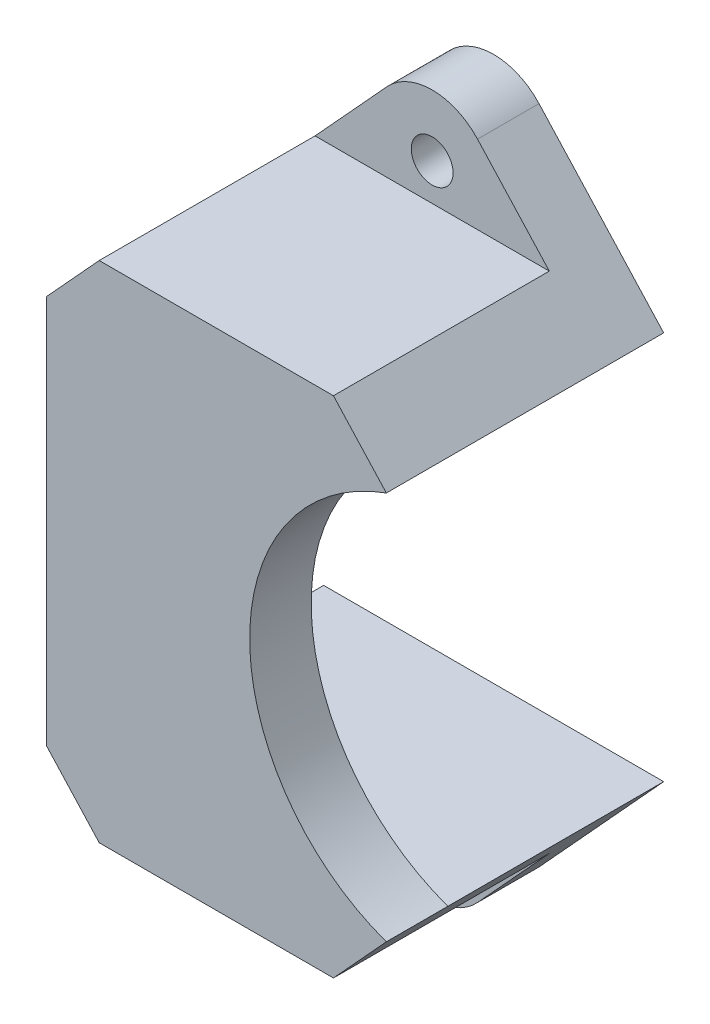
ISO-10303-21;
HEADER;
FILE_DESCRIPTION(('STEP AP214'),'2;1');
FILE_NAME('part.step','',(''),(''),'','','');
FILE_SCHEMA(('AUTOMOTIVE_DESIGN { 1 0 10303 214 1 1 1 1 }'));
ENDSEC;
DATA;
#1=APPLICATION_CONTEXT('core data for automotive mechanical design processes');
#2=APPLICATION_PROTOCOL_DEFINITION('international standard','automotive_design',2000,#1);
#3=PRODUCT_CONTEXT('',#1,'mechanical');
#4=PRODUCT('Part','Part','',(#3));
#5=PRODUCT_RELATED_PRODUCT_CATEGORY('part','',(#4));
#6=PRODUCT_DEFINITION_FORMATION('','',#4);
#7=PRODUCT_DEFINITION_CONTEXT('part definition',#1,'design');
#8=PRODUCT_DEFINITION('design','',#6,#7);
#9=PRODUCT_DEFINITION_SHAPE('','',#8);
#10=(LENGTH_UNIT() NAMED_UNIT(*) SI_UNIT(.MILLI.,.METRE.));
#11=(NAMED_UNIT(*) PLANE_ANGLE_UNIT() SI_UNIT($,.RADIAN.));
#12=(NAMED_UNIT(*) SI_UNIT($,.STERADIAN.) SOLID_ANGLE_UNIT());
#13=UNCERTAINTY_MEASURE_WITH_UNIT(LENGTH_MEASURE(1.E-05),#10,'distance_accuracy_value','');
#14=(GEOMETRIC_REPRESENTATION_CONTEXT(3) GLOBAL_UNCERTAINTY_ASSIGNED_CONTEXT((#13)) GLOBAL_UNIT_ASSIGNED_CONTEXT((#10,
#11,#12)) REPRESENTATION_CONTEXT('',''));
#15=CARTESIAN_POINT('',(0.,0.,0.));
#16=DIRECTION('',(0.,0.,1.));
#17=DIRECTION('',(1.,0.,0.));
#18=AXIS2_PLACEMENT_3D('',#15,#16,#17);
#19=CARTESIAN_POINT('',(19.5,2.7061803555275E-10,17.55));
#20=DIRECTION('',(0.,0.,1.));
#21=DIRECTION('',(1.,0.,0.));
#22=AXIS2_PLACEMENT_3D('',#19,#20,#21);
#23=PLANE('',#22);
#24=DIRECTION('',(1.,0.,0.));
#25=VECTOR('',#24,1.);
#26=CARTESIAN_POINT('',(0.,-15.7999999999998,17.55));
#27=LINE('',#26,#25);
#28=CARTESIAN_POINT('',(-13.8234309034988,-15.7999999999998,17.55));
#29=VERTEX_POINT('',#28);
#30=CARTESIAN_POINT('',(13.8234309050053,-15.7999999999998,17.55));
#31=VERTEX_POINT('',#30);
#32=EDGE_CURVE('E220',#29,#31,#27,.T.);
#33=ORIENTED_EDGE('',*,*,#32,.F.);
#34=DIRECTION('',(0.,-1.,0.));
#35=VECTOR('',#34,1.);
#36=CARTESIAN_POINT('',(-13.8234309034988,15.7999999999999,17.55));
#37=LINE('',#36,#35);
#38=CARTESIAN_POINT('',(-13.8234309034988,15.7999999999998,17.55));
#39=VERTEX_POINT('',#38);
#40=EDGE_CURVE('E153',#39,#29,#37,.T.);
#41=ORIENTED_EDGE('',*,*,#40,.F.);
#42=DIRECTION('',(1.,0.,0.));
#43=VECTOR('',#42,1.);
#44=CARTESIAN_POINT('',(0.,15.7999999999998,17.55));
#45=LINE('',#44,#43);
#46=CARTESIAN_POINT('',(13.8234309034988,15.7999999999999,17.55));
#47=VERTEX_POINT('',#46);
#48=EDGE_CURVE('E124',#39,#47,#45,.T.);
#49=ORIENTED_EDGE('',*,*,#48,.T.);
#50=CARTESIAN_POINT('',(19.5,2.7061803555275E-10,17.55));
#51=DIRECTION('',(0.,0.,1.));
#52=DIRECTION('',(1.,0.,0.));
#53=AXIS2_PLACEMENT_3D('',#50,#51,#52);
#54=CIRCLE('',#53,16.7887890182346);
#55=EDGE_CURVE('E157',#47,#31,#54,.T.);
#56=ORIENTED_EDGE('',*,*,#55,.T.);
#57=EDGE_LOOP('',(#33,#41,#49,#56));
#58=FACE_BOUND('',#57,.T.);
#59=ADVANCED_FACE('F36',(#58),#23,.F.);
#60=CARTESIAN_POINT('',(0.,0.,5.));
#61=DIRECTION('',(0.,0.,1.));
#62=DIRECTION('',(1.,0.,0.));
#63=AXIS2_PLACEMENT_3D('',#60,#61,#62);
#64=PLANE('',#63);
#65=CARTESIAN_POINT('',(0.,23.4999999999998,5.));
#66=DIRECTION('',(0.,0.,1.));
#67=DIRECTION('',(1.,0.,0.));
#68=AXIS2_PLACEMENT_3D('',#65,#66,#67);
#69=CIRCLE('',#68,1.7);
#70=CARTESIAN_POINT('',(1.7,23.4999999999998,5.));
#71=VERTEX_POINT('',#70);
#72=EDGE_CURVE('E107',#71,#71,#69,.T.);
#73=ORIENTED_EDGE('',*,*,#72,.F.);
#74=EDGE_LOOP('',(#73));
#75=FACE_BOUND('',#74,.T.);
#76=DIRECTION('',(-0.67508218946842,-0.737742527893387,0.));
#77=VECTOR('',#76,1.);
#78=CARTESIAN_POINT('',(-15.3925784028313,14.0852060669727,5.));
#79=LINE('',#78,#77);
#80=CARTESIAN_POINT('',(-3.68871263946693,26.8754109473419,5.));
#81=VERTEX_POINT('',#80);
#82=CARTESIAN_POINT('',(-9.52262652997057,20.5,5.));
#83=VERTEX_POINT('',#82);
#84=EDGE_CURVE('E60',#81,#83,#79,.T.);
#85=ORIENTED_EDGE('',*,*,#84,.T.);
#86=DIRECTION('',(1.,0.,0.));
#87=VECTOR('',#86,1.);
#88=CARTESIAN_POINT('',(2.31536281615919E-13,20.4999999999999,5.));
#89=LINE('',#88,#87);
#90=CARTESIAN_POINT('',(9.52262652997076,20.4999999999998,5.));
#91=VERTEX_POINT('',#90);
#92=EDGE_CURVE('E134',#83,#91,#89,.T.);
#93=ORIENTED_EDGE('',*,*,#92,.T.);
#94=DIRECTION('',(0.67508218946842,-0.737742527893387,0.));
#95=VECTOR('',#94,1.);
#96=CARTESIAN_POINT('',(15.3925784028313,14.0852060669727,5.));
#97=LINE('',#96,#95);
#98=CARTESIAN_POINT('',(3.68871263946693,26.8754109473419,5.));
#99=VERTEX_POINT('',#98);
#100=EDGE_CURVE('E111',#99,#91,#97,.T.);
#101=ORIENTED_EDGE('',*,*,#100,.F.);
#102=CARTESIAN_POINT('',(0.,23.4999999999998,5.));
#103=DIRECTION('',(0.,0.,1.));
#104=DIRECTION('',(1.,0.,0.));
#105=AXIS2_PLACEMENT_3D('',#102,#103,#104);
#106=CIRCLE('',#105,5.);
#107=EDGE_CURVE('E126',#99,#81,#106,.T.);
#108=ORIENTED_EDGE('',*,*,#107,.T.);
#109=EDGE_LOOP('',(#85,#93,#101,#108));
#110=FACE_BOUND('',#109,.T.);
#111=ADVANCED_FACE('F293',(#75,#110),#64,.T.);
#112=CARTESIAN_POINT('',(15.3925784028313,14.0852060669727,5.));
#113=DIRECTION('',(0.737742527893387,0.67508218946842,0.));
#114=DIRECTION('',(-0.67508218946842,0.737742527893387,0.));
#115=AXIS2_PLACEMENT_3D('',#112,#113,#114);
#116=PLANE('',#115);
#117=DIRECTION('',(0.67508218946842,-0.737742527893387,0.));
#118=VECTOR('',#117,1.);
#119=CARTESIAN_POINT('',(15.3925784028313,14.0852060669727,0.));
#120=LINE('',#119,#118);
#121=CARTESIAN_POINT('',(3.68871263946693,26.8754109473419,0.));
#122=VERTEX_POINT('',#121);
#123=CARTESIAN_POINT('',(13.8234309034988,15.7999999999998,0.));
#124=VERTEX_POINT('',#123);
#125=EDGE_CURVE('E83',#122,#124,#120,.T.);
#126=ORIENTED_EDGE('',*,*,#125,.F.);
#127=DIRECTION('',(0.,0.,-1.));
#128=VECTOR('',#127,1.);
#129=CARTESIAN_POINT('',(3.68871263946693,26.8754109473419,5.));
#130=LINE('',#129,#128);
#131=EDGE_CURVE('E11',#99,#122,#130,.T.);
#132=ORIENTED_EDGE('',*,*,#131,.F.);
#133=ORIENTED_EDGE('',*,*,#100,.T.);
#134=DIRECTION('',(0.,0.,-1.));
#135=VECTOR('',#134,1.);
#136=CARTESIAN_POINT('',(9.52262652997076,20.4999999999998,45.9435191760098));
#137=LINE('',#136,#135);
#138=CARTESIAN_POINT('',(9.52262652997076,20.4999999999998,22.55));
#139=VERTEX_POINT('',#138);
#140=EDGE_CURVE('E51',#139,#91,#137,.T.);
#141=ORIENTED_EDGE('',*,*,#140,.F.);
#142=DIRECTION('',(0.67508218946842,-0.737742527893387,0.));
#143=VECTOR('',#142,1.);
#144=CARTESIAN_POINT('',(9.52262652997076,20.4999999999998,22.55));
#145=LINE('',#144,#143);
#146=CARTESIAN_POINT('',(13.8234309034988,15.7999999999999,22.55));
#147=VERTEX_POINT('',#146);
#148=EDGE_CURVE('E175',#139,#147,#145,.T.);
#149=ORIENTED_EDGE('',*,*,#148,.T.);
#150=DIRECTION('',(0.,0.,-1.));
#151=VECTOR('',#150,1.);
#152=CARTESIAN_POINT('',(13.8234309034988,15.7999999999999,22.55));
#153=LINE('',#152,#151);
#154=EDGE_CURVE('E87',#147,#47,#153,.T.);
#155=ORIENTED_EDGE('',*,*,#154,.T.);
#156=DIRECTION('',(0.,0.,-1.));
#157=VECTOR('',#156,1.);
#158=CARTESIAN_POINT('',(13.8234309034988,15.7999999999998,5.));
#159=LINE('',#158,#157);
#160=EDGE_CURVE('E80',#47,#124,#159,.T.);
#161=ORIENTED_EDGE('',*,*,#160,.T.);
#162=EDGE_LOOP('',(#126,#132,#133,#141,#149,#155,#161));
#163=FACE_BOUND('',#162,.T.);
#164=ADVANCED_FACE('F82',(#163),#116,.T.);
#165=CARTESIAN_POINT('',(0.,23.4999999999998,5.));
#166=DIRECTION('',(0.,0.,-1.));
#167=DIRECTION('',(-1.,0.,0.));
#168=AXIS2_PLACEMENT_3D('',#165,#166,#167);
#169=CYLINDRICAL_SURFACE('',#168,5.);
#170=CARTESIAN_POINT('',(0.,23.4999999999998,0.));
#171=DIRECTION('',(0.,0.,1.));
#172=DIRECTION('',(1.,0.,0.));
#173=AXIS2_PLACEMENT_3D('',#170,#171,#172);
#174=CIRCLE('',#173,5.);
#175=CARTESIAN_POINT('',(-3.68871263946693,26.8754109473419,0.));
#176=VERTEX_POINT('',#175);
#177=EDGE_CURVE('E101',#122,#176,#174,.T.);
#178=ORIENTED_EDGE('',*,*,#177,.T.);
#179=DIRECTION('',(0.,0.,-1.));
#180=VECTOR('',#179,1.);
#181=CARTESIAN_POINT('',(-3.68871263946693,26.8754109473419,5.));
#182=LINE('',#181,#180);
#183=EDGE_CURVE('E44',#81,#176,#182,.T.);
#184=ORIENTED_EDGE('',*,*,#183,.F.);
#185=ORIENTED_EDGE('',*,*,#107,.F.);
#186=ORIENTED_EDGE('',*,*,#131,.T.);
#187=EDGE_LOOP('',(#178,#184,#185,#186));
#188=FACE_BOUND('',#187,.T.);
#189=ADVANCED_FACE('F120',(#188),#169,.T.);
#190=CARTESIAN_POINT('',(-15.3925784028313,14.0852060669727,5.));
#191=DIRECTION('',(0.737742527893387,-0.67508218946842,0.));
#192=DIRECTION('',(0.67508218946842,0.737742527893387,0.));
#193=AXIS2_PLACEMENT_3D('',#190,#191,#192);
#194=PLANE('',#193);
#195=DIRECTION('',(-0.67508218946842,-0.737742527893387,0.));
#196=VECTOR('',#195,1.);
#197=CARTESIAN_POINT('',(-15.3925784028313,14.0852060669727,0.));
#198=LINE('',#197,#196);
#199=CARTESIAN_POINT('',(-13.8234309034988,15.7999999999998,0.));
#200=VERTEX_POINT('',#199);
#201=EDGE_CURVE('E108',#176,#200,#198,.T.);
#202=ORIENTED_EDGE('',*,*,#201,.T.);
#203=DIRECTION('',(0.,0.,-1.));
#204=VECTOR('',#203,1.);
#205=CARTESIAN_POINT('',(-13.8234309034988,15.7999999999998,5.));
#206=LINE('',#205,#204);
#207=EDGE_CURVE('E93',#39,#200,#206,.T.);
#208=ORIENTED_EDGE('',*,*,#207,.F.);
#209=DIRECTION('',(0.,0.,-1.));
#210=VECTOR('',#209,1.);
#211=CARTESIAN_POINT('',(-13.8234309034988,15.7999999999999,22.55));
#212=LINE('',#211,#210);
#213=CARTESIAN_POINT('',(-13.8234309034988,15.7999999999999,22.55));
#214=VERTEX_POINT('',#213);
#215=EDGE_CURVE('E132',#214,#39,#212,.T.);
#216=ORIENTED_EDGE('',*,*,#215,.F.);
#217=DIRECTION('',(0.67508218946842,0.737742527893387,0.));
#218=VECTOR('',#217,1.);
#219=CARTESIAN_POINT('',(-13.8234309034988,15.7999999999999,22.55));
#220=LINE('',#219,#218);
#221=CARTESIAN_POINT('',(-9.52262652997057,20.5,22.55));
#222=VERTEX_POINT('',#221);
#223=EDGE_CURVE('E156',#214,#222,#220,.T.);
#224=ORIENTED_EDGE('',*,*,#223,.T.);
#225=DIRECTION('',(0.,0.,-1.));
#226=VECTOR('',#225,1.);
#227=CARTESIAN_POINT('',(-9.52262652997057,20.5,45.9435191760098));
#228=LINE('',#227,#226);
#229=EDGE_CURVE('E131',#222,#83,#228,.T.);
#230=ORIENTED_EDGE('',*,*,#229,.T.);
#231=ORIENTED_EDGE('',*,*,#84,.F.);
#232=ORIENTED_EDGE('',*,*,#183,.T.);
#233=EDGE_LOOP('',(#202,#208,#216,#224,#230,#231,#232));
#234=FACE_BOUND('',#233,.T.);
#235=ADVANCED_FACE('F117',(#234),#194,.F.);
#236=CARTESIAN_POINT('',(0.,23.4999999999998,5.));
#237=DIRECTION('',(0.,0.,-1.));
#238=DIRECTION('',(-1.,0.,0.));
#239=AXIS2_PLACEMENT_3D('',#236,#237,#238);
#240=CYLINDRICAL_SURFACE('',#239,1.7);
#241=ORIENTED_EDGE('',*,*,#72,.T.);
#242=EDGE_LOOP('',(#241));
#243=FACE_BOUND('',#242,.T.);
#244=CARTESIAN_POINT('',(0.,23.4999999999998,0.));
#245=DIRECTION('',(0.,0.,1.));
#246=DIRECTION('',(1.,0.,0.));
#247=AXIS2_PLACEMENT_3D('',#244,#245,#246);
#248=CIRCLE('',#247,1.7);
#249=CARTESIAN_POINT('',(1.7,23.4999999999998,0.));
#250=VERTEX_POINT('',#249);
#251=EDGE_CURVE('E102',#250,#250,#248,.T.);
#252=ORIENTED_EDGE('',*,*,#251,.F.);
#253=EDGE_LOOP('',(#252));
#254=FACE_BOUND('',#253,.T.);
#255=ADVANCED_FACE('F38',(#243,#254),#240,.F.);
#256=CARTESIAN_POINT('',(0.,15.7999999999998,5.));
#257=DIRECTION('',(0.,-1.,0.));
#258=DIRECTION('',(0.,0.,-1.));
#259=AXIS2_PLACEMENT_3D('',#256,#257,#258);
#260=PLANE('',#259);
#261=DIRECTION('',(-1.,0.,0.));
#262=VECTOR('',#261,1.);
#263=CARTESIAN_POINT('',(0.,15.7999999999998,0.));
#264=LINE('',#263,#262);
#265=EDGE_CURVE('E99',#124,#200,#264,.T.);
#266=ORIENTED_EDGE('',*,*,#265,.F.);
#267=ORIENTED_EDGE('',*,*,#160,.F.);
#268=ORIENTED_EDGE('',*,*,#48,.F.);
#269=ORIENTED_EDGE('',*,*,#207,.T.);
#270=EDGE_LOOP('',(#266,#267,#268,#269));
#271=FACE_BOUND('',#270,.T.);
#272=ADVANCED_FACE('F104',(#271),#260,.T.);
#273=CARTESIAN_POINT('',(0.,0.,0.));
#274=DIRECTION('',(0.,0.,1.));
#275=DIRECTION('',(1.,0.,0.));
#276=AXIS2_PLACEMENT_3D('',#273,#274,#275);
#277=PLANE('',#276);
#278=ORIENTED_EDGE('',*,*,#251,.T.);
#279=EDGE_LOOP('',(#278));
#280=FACE_BOUND('',#279,.T.);
#281=ORIENTED_EDGE('',*,*,#125,.T.);
#282=ORIENTED_EDGE('',*,*,#265,.T.);
#283=ORIENTED_EDGE('',*,*,#201,.F.);
#284=ORIENTED_EDGE('',*,*,#177,.F.);
#285=EDGE_LOOP('',(#281,#282,#283,#284));
#286=FACE_BOUND('',#285,.T.);
#287=ADVANCED_FACE('F98',(#280,#286),#277,.F.);
#288=CARTESIAN_POINT('',(2.31536281615919E-13,20.4999999999999,45.9435191760098));
#289=DIRECTION('',(0.,1.,0.));
#290=DIRECTION('',(-1.,0.,0.));
#291=AXIS2_PLACEMENT_3D('',#288,#289,#290);
#292=PLANE('',#291);
#293=ORIENTED_EDGE('',*,*,#229,.F.);
#294=DIRECTION('',(1.,0.,0.));
#295=VECTOR('',#294,1.);
#296=CARTESIAN_POINT('',(-9.52262652997057,20.5,22.55));
#297=LINE('',#296,#295);
#298=EDGE_CURVE('E177',#222,#139,#297,.T.);
#299=ORIENTED_EDGE('',*,*,#298,.T.);
#300=ORIENTED_EDGE('',*,*,#140,.T.);
#301=ORIENTED_EDGE('',*,*,#92,.F.);
#302=EDGE_LOOP('',(#293,#299,#300,#301));
#303=FACE_BOUND('',#302,.T.);
#304=ADVANCED_FACE('F290',(#303),#292,.T.);
#305=CARTESIAN_POINT('',(-13.8234309034988,15.7999999999999,22.55));
#306=DIRECTION('',(1.,0.,0.));
#307=DIRECTION('',(0.,1.,0.));
#308=AXIS2_PLACEMENT_3D('',#305,#306,#307);
#309=PLANE('',#308);
#310=ORIENTED_EDGE('',*,*,#40,.T.);
#311=DIRECTION('',(0.,0.,-1.));
#312=VECTOR('',#311,1.);
#313=CARTESIAN_POINT('',(-13.8234309034988,-15.7999999999998,22.55));
#314=LINE('',#313,#312);
#315=CARTESIAN_POINT('',(-13.8234309034988,-15.7999999999998,22.55));
#316=VERTEX_POINT('',#315);
#317=EDGE_CURVE('E148',#316,#29,#314,.T.);
#318=ORIENTED_EDGE('',*,*,#317,.F.);
#319=DIRECTION('',(0.,-1.,0.));
#320=VECTOR('',#319,1.);
#321=CARTESIAN_POINT('',(-13.8234309034988,15.7999999999999,22.55));
#322=LINE('',#321,#320);
#323=EDGE_CURVE('E139',#214,#316,#322,.T.);
#324=ORIENTED_EDGE('',*,*,#323,.F.);
#325=ORIENTED_EDGE('',*,*,#215,.T.);
#326=EDGE_LOOP('',(#310,#318,#324,#325));
#327=FACE_BOUND('',#326,.T.);
#328=ADVANCED_FACE('F314',(#327),#309,.F.);
#329=CARTESIAN_POINT('',(-9.52262652997078,-20.4999999999997,22.55));
#330=DIRECTION('',(-0.737742527893387,-0.675082189468419,0.));
#331=DIRECTION('',(0.675082189468419,-0.737742527893387,0.));
#332=AXIS2_PLACEMENT_3D('',#329,#330,#331);
#333=PLANE('',#332);
#334=ORIENTED_EDGE('',*,*,#317,.T.);
#335=DIRECTION('',(0.,0.,-1.));
#336=VECTOR('',#335,1.);
#337=CARTESIAN_POINT('',(-13.8234309034991,-15.7999999999995,5.));
#338=LINE('',#337,#336);
#339=CARTESIAN_POINT('',(-13.8234309034991,-15.7999999999995,0.));
#340=VERTEX_POINT('',#339);
#341=EDGE_CURVE('E186',#29,#340,#338,.T.);
#342=ORIENTED_EDGE('',*,*,#341,.T.);
#343=DIRECTION('',(-0.67508218946842,0.737742527893387,0.));
#344=VECTOR('',#343,1.);
#345=CARTESIAN_POINT('',(-15.3925784028313,-14.0852060669727,0.));
#346=LINE('',#345,#344);
#347=CARTESIAN_POINT('',(-3.68871263946693,-26.8754109473419,0.));
#348=VERTEX_POINT('',#347);
#349=EDGE_CURVE('E197',#348,#340,#346,.T.);
#350=ORIENTED_EDGE('',*,*,#349,.F.);
#351=DIRECTION('',(0.,0.,-1.));
#352=VECTOR('',#351,1.);
#353=CARTESIAN_POINT('',(-3.68871263946693,-26.8754109473419,5.));
#354=LINE('',#353,#352);
#355=CARTESIAN_POINT('',(-3.68871263946693,-26.8754109473419,5.));
#356=VERTEX_POINT('',#355);
#357=EDGE_CURVE('E189',#356,#348,#354,.T.);
#358=ORIENTED_EDGE('',*,*,#357,.F.);
#359=DIRECTION('',(-0.67508218946842,0.737742527893387,0.));
#360=VECTOR('',#359,1.);
#361=CARTESIAN_POINT('',(-15.3925784028313,-14.0852060669727,5.));
#362=LINE('',#361,#360);
#363=CARTESIAN_POINT('',(-9.52262652997077,-20.4999999999998,5.));
#364=VERTEX_POINT('',#363);
#365=EDGE_CURVE('E212',#356,#364,#362,.T.);
#366=ORIENTED_EDGE('',*,*,#365,.T.);
#367=DIRECTION('',(0.,0.,-1.));
#368=VECTOR('',#367,1.);
#369=CARTESIAN_POINT('',(-9.52262652997078,-20.4999999999997,22.55));
#370=LINE('',#369,#368);
#371=CARTESIAN_POINT('',(-9.52262652997078,-20.4999999999997,22.55));
#372=VERTEX_POINT('',#371);
#373=EDGE_CURVE('E145',#372,#364,#370,.T.);
#374=ORIENTED_EDGE('',*,*,#373,.F.);
#375=DIRECTION('',(-0.675082189468419,0.737742527893387,0.));
#376=VECTOR('',#375,1.);
#377=CARTESIAN_POINT('',(-9.52262652997078,-20.4999999999997,22.55));
#378=LINE('',#377,#376);
#379=EDGE_CURVE('E163',#372,#316,#378,.T.);
#380=ORIENTED_EDGE('',*,*,#379,.T.);
#381=EDGE_LOOP('',(#334,#342,#350,#358,#366,#374,#380));
#382=FACE_BOUND('',#381,.T.);
#383=ADVANCED_FACE('F245',(#382),#333,.T.);
#384=CARTESIAN_POINT('',(9.52262652997076,-20.4999999999997,22.55));
#385=DIRECTION('',(0.,-1.,0.));
#386=DIRECTION('',(0.,0.,-1.));
#387=AXIS2_PLACEMENT_3D('',#384,#385,#386);
#388=PLANE('',#387);
#389=ORIENTED_EDGE('',*,*,#373,.T.);
#390=DIRECTION('',(1.,0.,0.));
#391=VECTOR('',#390,1.);
#392=CARTESIAN_POINT('',(0.,-20.4999999999998,5.));
#393=LINE('',#392,#391);
#394=CARTESIAN_POINT('',(9.52262652997076,-20.4999999999998,5.));
#395=VERTEX_POINT('',#394);
#396=EDGE_CURVE('E209',#364,#395,#393,.T.);
#397=ORIENTED_EDGE('',*,*,#396,.T.);
#398=DIRECTION('',(0.,0.,-1.));
#399=VECTOR('',#398,1.);
#400=CARTESIAN_POINT('',(9.52262652997076,-20.4999999999997,22.55));
#401=LINE('',#400,#399);
#402=CARTESIAN_POINT('',(9.52262652997076,-20.4999999999997,22.55));
#403=VERTEX_POINT('',#402);
#404=EDGE_CURVE('E142',#403,#395,#401,.T.);
#405=ORIENTED_EDGE('',*,*,#404,.F.);
#406=DIRECTION('',(-1.,0.,0.));
#407=VECTOR('',#406,1.);
#408=CARTESIAN_POINT('',(9.52262652997076,-20.4999999999997,22.55));
#409=LINE('',#408,#407);
#410=EDGE_CURVE('E166',#403,#372,#409,.T.);
#411=ORIENTED_EDGE('',*,*,#410,.T.);
#412=EDGE_LOOP('',(#389,#397,#405,#411));
#413=FACE_BOUND('',#412,.T.);
#414=ADVANCED_FACE('F228',(#413),#388,.T.);
#415=CARTESIAN_POINT('',(13.8234309050053,-15.7999999999998,22.55));
#416=DIRECTION('',(0.737742527775614,-0.675082189597124,0.));
#417=DIRECTION('',(0.675082189597124,0.737742527775614,0.));
#418=AXIS2_PLACEMENT_3D('',#415,#416,#417);
#419=PLANE('',#418);
#420=ORIENTED_EDGE('',*,*,#404,.T.);
#421=DIRECTION('',(0.675082189468402,0.737742527893403,0.));
#422=VECTOR('',#421,1.);
#423=CARTESIAN_POINT('',(15.3925784028314,-14.085206066972,5.));
#424=LINE('',#423,#422);
#425=CARTESIAN_POINT('',(3.68871263946678,-26.875410947342,5.));
#426=VERTEX_POINT('',#425);
#427=EDGE_CURVE('E215',#426,#395,#424,.T.);
#428=ORIENTED_EDGE('',*,*,#427,.F.);
#429=DIRECTION('',(0.,0.,-1.));
#430=VECTOR('',#429,1.);
#431=CARTESIAN_POINT('',(3.68871263946678,-26.875410947342,5.));
#432=LINE('',#431,#430);
#433=CARTESIAN_POINT('',(3.68871263946678,-26.875410947342,0.));
#434=VERTEX_POINT('',#433);
#435=EDGE_CURVE('E160',#426,#434,#432,.T.);
#436=ORIENTED_EDGE('',*,*,#435,.T.);
#437=DIRECTION('',(0.675082189468402,0.737742527893403,0.));
#438=VECTOR('',#437,1.);
#439=CARTESIAN_POINT('',(15.3925784028314,-14.085206066972,0.));
#440=LINE('',#439,#438);
#441=CARTESIAN_POINT('',(13.8234309034986,-15.7999999999995,0.));
#442=VERTEX_POINT('',#441);
#443=EDGE_CURVE('E203',#434,#442,#440,.T.);
#444=ORIENTED_EDGE('',*,*,#443,.T.);
#445=DIRECTION('',(0.,0.,-1.));
#446=VECTOR('',#445,1.);
#447=CARTESIAN_POINT('',(13.8234309034986,-15.7999999999995,5.));
#448=LINE('',#447,#446);
#449=EDGE_CURVE('E183',#31,#442,#448,.T.);
#450=ORIENTED_EDGE('',*,*,#449,.F.);
#451=DIRECTION('',(0.,0.,-1.));
#452=VECTOR('',#451,1.);
#453=CARTESIAN_POINT('',(13.8234309050053,-15.7999999999998,22.55));
#454=LINE('',#453,#452);
#455=CARTESIAN_POINT('',(13.8234309050053,-15.7999999999998,22.55));
#456=VERTEX_POINT('',#455);
#457=EDGE_CURVE('E138',#456,#31,#454,.T.);
#458=ORIENTED_EDGE('',*,*,#457,.F.);
#459=DIRECTION('',(-0.675082189597124,-0.737742527775614,0.));
#460=VECTOR('',#459,1.);
#461=CARTESIAN_POINT('',(13.8234309050053,-15.7999999999998,22.55));
#462=LINE('',#461,#460);
#463=EDGE_CURVE('E169',#456,#403,#462,.T.);
#464=ORIENTED_EDGE('',*,*,#463,.T.);
#465=EDGE_LOOP('',(#420,#428,#436,#444,#450,#458,#464));
#466=FACE_BOUND('',#465,.T.);
#467=ADVANCED_FACE('F305',(#466),#419,.T.);
#468=CARTESIAN_POINT('',(19.5,2.7061803555275E-10,22.55));
#469=DIRECTION('',(0.,0.,-1.));
#470=DIRECTION('',(-1.,0.,0.));
#471=AXIS2_PLACEMENT_3D('',#468,#469,#470);
#472=CYLINDRICAL_SURFACE('',#471,16.7887890182346);
#473=ORIENTED_EDGE('',*,*,#55,.F.);
#474=ORIENTED_EDGE('',*,*,#154,.F.);
#475=CARTESIAN_POINT('',(19.5,2.7061803555275E-10,22.55));
#476=DIRECTION('',(0.,0.,1.));
#477=DIRECTION('',(1.,0.,0.));
#478=AXIS2_PLACEMENT_3D('',#475,#476,#477);
#479=CIRCLE('',#478,16.7887890182346);
#480=EDGE_CURVE('E172',#147,#456,#479,.T.);
#481=ORIENTED_EDGE('',*,*,#480,.T.);
#482=ORIENTED_EDGE('',*,*,#457,.T.);
#483=EDGE_LOOP('',(#473,#474,#481,#482));
#484=FACE_BOUND('',#483,.T.);
#485=ADVANCED_FACE('F300',(#484),#472,.F.);
#486=CARTESIAN_POINT('',(19.5,2.7061803555275E-10,22.55));
#487=DIRECTION('',(0.,0.,1.));
#488=DIRECTION('',(1.,0.,0.));
#489=AXIS2_PLACEMENT_3D('',#486,#487,#488);
#490=PLANE('',#489);
#491=ORIENTED_EDGE('',*,*,#223,.F.);
#492=ORIENTED_EDGE('',*,*,#323,.T.);
#493=ORIENTED_EDGE('',*,*,#379,.F.);
#494=ORIENTED_EDGE('',*,*,#410,.F.);
#495=ORIENTED_EDGE('',*,*,#463,.F.);
#496=ORIENTED_EDGE('',*,*,#480,.F.);
#497=ORIENTED_EDGE('',*,*,#148,.F.);
#498=ORIENTED_EDGE('',*,*,#298,.F.);
#499=EDGE_LOOP('',(#491,#492,#493,#494,#495,#496,#497,#498));
#500=FACE_BOUND('',#499,.T.);
#501=ADVANCED_FACE('F297',(#500),#490,.T.);
#502=CARTESIAN_POINT('',(0.,-23.4999999999998,5.));
#503=DIRECTION('',(0.,0.,-1.));
#504=DIRECTION('',(-1.,0.,0.));
#505=AXIS2_PLACEMENT_3D('',#502,#503,#504);
#506=CYLINDRICAL_SURFACE('',#505,5.);
#507=CARTESIAN_POINT('',(0.,-23.4999999999998,0.));
#508=DIRECTION('',(0.,0.,1.));
#509=DIRECTION('',(1.,0.,0.));
#510=AXIS2_PLACEMENT_3D('',#507,#508,#509);
#511=CIRCLE('',#510,5.);
#512=EDGE_CURVE('E206',#434,#348,#511,.F.);
#513=ORIENTED_EDGE('',*,*,#512,.F.);
#514=ORIENTED_EDGE('',*,*,#435,.F.);
#515=CARTESIAN_POINT('',(0.,-23.4999999999998,5.));
#516=DIRECTION('',(0.,0.,1.));
#517=DIRECTION('',(1.,0.,0.));
#518=AXIS2_PLACEMENT_3D('',#515,#516,#517);
#519=CIRCLE('',#518,5.);
#520=EDGE_CURVE('E196',#426,#356,#519,.F.);
#521=ORIENTED_EDGE('',*,*,#520,.T.);
#522=ORIENTED_EDGE('',*,*,#357,.T.);
#523=EDGE_LOOP('',(#513,#514,#521,#522));
#524=FACE_BOUND('',#523,.T.);
#525=ADVANCED_FACE('F255',(#524),#506,.T.);
#526=CARTESIAN_POINT('',(0.,-15.7999999999995,5.));
#527=DIRECTION('',(0.,-1.,0.));
#528=DIRECTION('',(1.,0.,0.));
#529=AXIS2_PLACEMENT_3D('',#526,#527,#528);
#530=PLANE('',#529);
#531=DIRECTION('',(-1.,0.,0.));
#532=VECTOR('',#531,1.);
#533=CARTESIAN_POINT('',(0.,-15.7999999999995,0.));
#534=LINE('',#533,#532);
#535=EDGE_CURVE('E200',#442,#340,#534,.T.);
#536=ORIENTED_EDGE('',*,*,#535,.T.);
#537=ORIENTED_EDGE('',*,*,#341,.F.);
#538=ORIENTED_EDGE('',*,*,#32,.T.);
#539=ORIENTED_EDGE('',*,*,#449,.T.);
#540=EDGE_LOOP('',(#536,#537,#538,#539));
#541=FACE_BOUND('',#540,.T.);
#542=ADVANCED_FACE('F310',(#541),#530,.F.);
#543=CARTESIAN_POINT('',(0.,-23.4999999999998,5.));
#544=DIRECTION('',(0.,0.,-1.));
#545=DIRECTION('',(-1.,0.,0.));
#546=AXIS2_PLACEMENT_3D('',#543,#544,#545);
#547=CYLINDRICAL_SURFACE('',#546,1.69999999999921);
#548=CARTESIAN_POINT('',(0.,-23.4999999999998,5.));
#549=DIRECTION('',(0.,0.,1.));
#550=DIRECTION('',(1.,0.,0.));
#551=AXIS2_PLACEMENT_3D('',#548,#549,#550);
#552=CIRCLE('',#551,1.69999999999921);
#553=CARTESIAN_POINT('',(1.69999999999921,-23.4999999999998,5.));
#554=VERTEX_POINT('',#553);
#555=EDGE_CURVE('E192',#554,#554,#552,.F.);
#556=ORIENTED_EDGE('',*,*,#555,.F.);
#557=EDGE_LOOP('',(#556));
#558=FACE_BOUND('',#557,.T.);
#559=CARTESIAN_POINT('',(0.,-23.4999999999998,0.));
#560=DIRECTION('',(0.,0.,1.));
#561=DIRECTION('',(1.,0.,0.));
#562=AXIS2_PLACEMENT_3D('',#559,#560,#561);
#563=CIRCLE('',#562,1.69999999999921);
#564=CARTESIAN_POINT('',(1.69999999999921,-23.4999999999998,0.));
#565=VERTEX_POINT('',#564);
#566=EDGE_CURVE('E193',#565,#565,#563,.F.);
#567=ORIENTED_EDGE('',*,*,#566,.T.);
#568=EDGE_LOOP('',(#567));
#569=FACE_BOUND('',#568,.T.);
#570=ADVANCED_FACE('F322',(#558,#569),#547,.F.);
#571=CARTESIAN_POINT('',(0.,0.,5.));
#572=DIRECTION('',(0.,0.,1.));
#573=DIRECTION('',(1.,0.,0.));
#574=AXIS2_PLACEMENT_3D('',#571,#572,#573);
#575=PLANE('',#574);
#576=ORIENTED_EDGE('',*,*,#396,.F.);
#577=ORIENTED_EDGE('',*,*,#365,.F.);
#578=ORIENTED_EDGE('',*,*,#520,.F.);
#579=ORIENTED_EDGE('',*,*,#427,.T.);
#580=EDGE_LOOP('',(#576,#577,#578,#579));
#581=FACE_BOUND('',#580,.T.);
#582=ORIENTED_EDGE('',*,*,#555,.T.);
#583=EDGE_LOOP('',(#582));
#584=FACE_BOUND('',#583,.T.);
#585=ADVANCED_FACE('F237',(#581,#584),#575,.T.);
#586=CARTESIAN_POINT('',(0.,0.,0.));
#587=DIRECTION('',(0.,0.,1.));
#588=DIRECTION('',(1.,0.,0.));
#589=AXIS2_PLACEMENT_3D('',#586,#587,#588);
#590=PLANE('',#589);
#591=ORIENTED_EDGE('',*,*,#512,.T.);
#592=ORIENTED_EDGE('',*,*,#349,.T.);
#593=ORIENTED_EDGE('',*,*,#535,.F.);
#594=ORIENTED_EDGE('',*,*,#443,.F.);
#595=EDGE_LOOP('',(#591,#592,#593,#594));
#596=FACE_BOUND('',#595,.T.);
#597=ORIENTED_EDGE('',*,*,#566,.F.);
#598=EDGE_LOOP('',(#597));
#599=FACE_BOUND('',#598,.T.);
#600=ADVANCED_FACE('F316',(#596,#599),#590,.F.);
#601=CLOSED_SHELL('',(#59,#111,#164,#189,#235,#255,#272,#287,#304,#328,#383,#414,#467,#485,#501,
#525,#542,#570,#585,#600));
#602=MANIFOLD_SOLID_BREP('B2',#601);
#603=ADVANCED_BREP_SHAPE_REPRESENTATION('',(#18,#602),#14);
#604=SHAPE_DEFINITION_REPRESENTATION(#9,#603);
ENDSEC;
END-ISO-10303-21;
